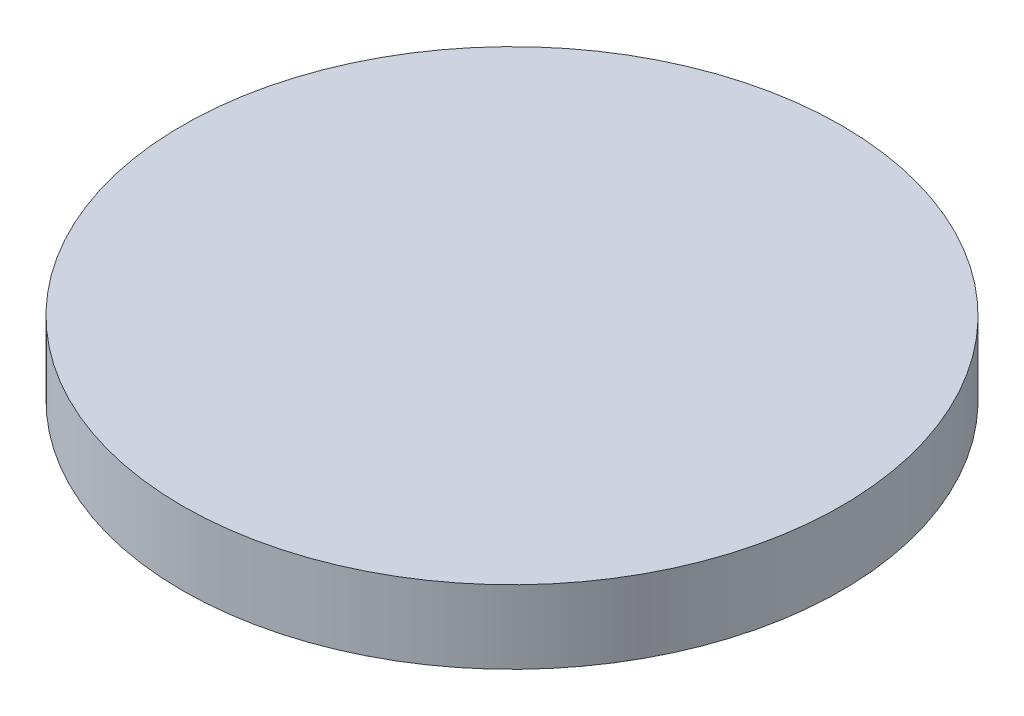
ISO-10303-21;
HEADER;
FILE_DESCRIPTION(('STEP AP214'),'2;1');
FILE_NAME('part.step','',(''),(''),'','','');
FILE_SCHEMA(('AUTOMOTIVE_DESIGN { 1 0 10303 214 1 1 1 1 }'));
ENDSEC;
DATA;
#1=APPLICATION_CONTEXT('core data for automotive mechanical design processes');
#2=APPLICATION_PROTOCOL_DEFINITION('international standard','automotive_design',2000,#1);
#3=PRODUCT_CONTEXT('',#1,'mechanical');
#4=PRODUCT('Part','Part','',(#3));
#5=PRODUCT_RELATED_PRODUCT_CATEGORY('part','',(#4));
#6=PRODUCT_DEFINITION_FORMATION('','',#4);
#7=PRODUCT_DEFINITION_CONTEXT('part definition',#1,'design');
#8=PRODUCT_DEFINITION('design','',#6,#7);
#9=PRODUCT_DEFINITION_SHAPE('','',#8);
#10=(LENGTH_UNIT() NAMED_UNIT(*) SI_UNIT(.MILLI.,.METRE.));
#11=(NAMED_UNIT(*) PLANE_ANGLE_UNIT() SI_UNIT($,.RADIAN.));
#12=(NAMED_UNIT(*) SI_UNIT($,.STERADIAN.) SOLID_ANGLE_UNIT());
#13=UNCERTAINTY_MEASURE_WITH_UNIT(LENGTH_MEASURE(1.E-05),#10,'distance_accuracy_value','');
#14=(GEOMETRIC_REPRESENTATION_CONTEXT(3) GLOBAL_UNCERTAINTY_ASSIGNED_CONTEXT((#13)) GLOBAL_UNIT_ASSIGNED_CONTEXT((#10,
#11,#12)) REPRESENTATION_CONTEXT('',''));
#15=CARTESIAN_POINT('',(0.,0.,0.));
#16=DIRECTION('',(0.,0.,1.));
#17=DIRECTION('',(1.,0.,0.));
#18=AXIS2_PLACEMENT_3D('',#15,#16,#17);
#19=CARTESIAN_POINT('',(0.,1.,0.));
#20=DIRECTION('',(0.,1.,0.));
#21=DIRECTION('',(0.,0.,1.));
#22=AXIS2_PLACEMENT_3D('',#19,#20,#21);
#23=PLANE('',#22);
#24=CARTESIAN_POINT('',(0.,1.,0.));
#25=DIRECTION('',(0.,-1.,0.));
#26=DIRECTION('',(0.,0.,-1.));
#27=AXIS2_PLACEMENT_3D('',#24,#25,#26);
#28=CIRCLE('',#27,4.5);
#29=CARTESIAN_POINT('',(0.,1.,-4.5));
#30=VERTEX_POINT('',#29);
#31=EDGE_CURVE('E17',#30,#30,#28,.T.);
#32=ORIENTED_EDGE('',*,*,#31,.F.);
#33=EDGE_LOOP('',(#32));
#34=FACE_BOUND('',#33,.T.);
#35=ADVANCED_FACE('F14',(#34),#23,.T.);
#36=CARTESIAN_POINT('',(0.,1.,0.));
#37=DIRECTION('',(0.,-1.,0.));
#38=DIRECTION('',(0.,0.,-1.));
#39=AXIS2_PLACEMENT_3D('',#36,#37,#38);
#40=CYLINDRICAL_SURFACE('',#39,4.5);
#41=ORIENTED_EDGE('',*,*,#31,.T.);
#42=EDGE_LOOP('',(#41));
#43=FACE_BOUND('',#42,.T.);
#44=CARTESIAN_POINT('',(0.,0.,0.));
#45=DIRECTION('',(0.,-1.,0.));
#46=DIRECTION('',(0.,0.,-1.));
#47=AXIS2_PLACEMENT_3D('',#44,#45,#46);
#48=CIRCLE('',#47,4.5);
#49=CARTESIAN_POINT('',(0.,0.,-4.5));
#50=VERTEX_POINT('',#49);
#51=EDGE_CURVE('E10',#50,#50,#48,.F.);
#52=ORIENTED_EDGE('',*,*,#51,.T.);
#53=EDGE_LOOP('',(#52));
#54=FACE_BOUND('',#53,.T.);
#55=ADVANCED_FACE('F26',(#43,#54),#40,.T.);
#56=CARTESIAN_POINT('',(0.,0.,0.));
#57=DIRECTION('',(0.,1.,0.));
#58=DIRECTION('',(0.,0.,1.));
#59=AXIS2_PLACEMENT_3D('',#56,#57,#58);
#60=PLANE('',#59);
#61=ORIENTED_EDGE('',*,*,#51,.F.);
#62=EDGE_LOOP('',(#61));
#63=FACE_BOUND('',#62,.T.);
#64=ADVANCED_FACE('F33',(#63),#60,.F.);
#65=CLOSED_SHELL('',(#35,#55,#64));
#66=MANIFOLD_SOLID_BREP('B1',#65);
#67=ADVANCED_BREP_SHAPE_REPRESENTATION('',(#18,#66),#14);
#68=SHAPE_DEFINITION_REPRESENTATION(#9,#67);
ENDSEC;
END-ISO-10303-21;
